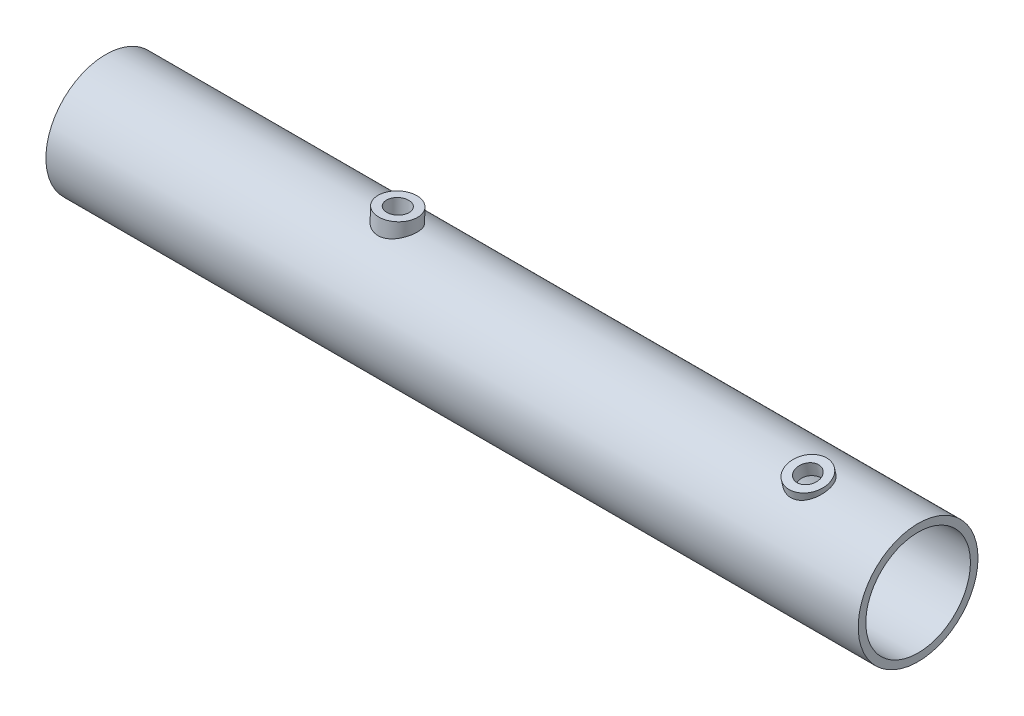
ISO-10303-21;
HEADER;
FILE_DESCRIPTION(('STEP AP214'),'2;1');
FILE_NAME('part.step','',(''),(''),'','','');
FILE_SCHEMA(('AUTOMOTIVE_DESIGN { 1 0 10303 214 1 1 1 1 }'));
ENDSEC;
DATA;
#1=APPLICATION_CONTEXT('core data for automotive mechanical design processes');
#2=APPLICATION_PROTOCOL_DEFINITION('international standard','automotive_design',2000,#1);
#3=PRODUCT_CONTEXT('',#1,'mechanical');
#4=PRODUCT('Part','Part','',(#3));
#5=PRODUCT_RELATED_PRODUCT_CATEGORY('part','',(#4));
#6=PRODUCT_DEFINITION_FORMATION('','',#4);
#7=PRODUCT_DEFINITION_CONTEXT('part definition',#1,'design');
#8=PRODUCT_DEFINITION('design','',#6,#7);
#9=PRODUCT_DEFINITION_SHAPE('','',#8);
#10=(LENGTH_UNIT() NAMED_UNIT(*) SI_UNIT(.MILLI.,.METRE.));
#11=(NAMED_UNIT(*) PLANE_ANGLE_UNIT() SI_UNIT($,.RADIAN.));
#12=(NAMED_UNIT(*) SI_UNIT($,.STERADIAN.) SOLID_ANGLE_UNIT());
#13=UNCERTAINTY_MEASURE_WITH_UNIT(LENGTH_MEASURE(1.E-05),#10,'distance_accuracy_value','');
#14=(GEOMETRIC_REPRESENTATION_CONTEXT(3) GLOBAL_UNCERTAINTY_ASSIGNED_CONTEXT((#13)) GLOBAL_UNIT_ASSIGNED_CONTEXT((#10,
#11,#12)) REPRESENTATION_CONTEXT('',''));
#15=CARTESIAN_POINT('',(0.,0.,0.));
#16=DIRECTION('',(0.,0.,1.));
#17=DIRECTION('',(1.,0.,0.));
#18=AXIS2_PLACEMENT_3D('',#15,#16,#17);
#19=CARTESIAN_POINT('',(295.,0.,0.));
#20=DIRECTION('',(-1.,0.,0.));
#21=DIRECTION('',(0.,0.,1.));
#22=AXIS2_PLACEMENT_3D('',#19,#20,#21);
#23=CYLINDRICAL_SURFACE('',#22,21.75);
#24=CARTESIAN_POINT('',(260.456376429784,18.3671321405636,11.6495045787826));
#25=CARTESIAN_POINT('',(260.646898102656,18.3671322417386,11.6495045007218));
#26=CARTESIAN_POINT('',(260.837421417738,18.3715626970911,11.6425279792126));
#27=CARTESIAN_POINT('',(261.217041275634,18.3891812990565,11.6146795241124));
#28=CARTESIAN_POINT('',(261.406137801234,18.4023695511696,11.5938074231295));
#29=CARTESIAN_POINT('',(261.781515058111,18.4372018067194,11.5383343317307));
#30=CARTESIAN_POINT('',(261.967795761762,18.458845893059,11.5037332067125));
#31=CARTESIAN_POINT('',(262.336289023577,18.5101185593613,11.4210496127633));
#32=CARTESIAN_POINT('',(262.518500030714,18.5397501290961,11.3729620955066));
#33=CARTESIAN_POINT('',(262.87711959476,18.6062822321463,11.263784134165));
#34=CARTESIAN_POINT('',(263.05354110399,18.6431650349375,11.2027253782472));
#35=CARTESIAN_POINT('',(263.399984059704,18.7235147451763,11.067910944351));
#36=CARTESIAN_POINT('',(263.570003093714,18.766984104073,10.994150537547));
#37=CARTESIAN_POINT('',(263.902523068557,18.8596627107682,10.8343961273323));
#38=CARTESIAN_POINT('',(264.065025642144,18.9088707037428,10.7484047974656));
#39=CARTESIAN_POINT('',(264.381639562437,19.0121510705117,10.5646453738589));
#40=CARTESIAN_POINT('',(264.53574763072,19.0662253232367,10.4668727262057));
#41=CARTESIAN_POINT('',(264.994705497099,19.2383436053802,10.1492809285233));
#42=CARTESIAN_POINT('',(265.284498725345,19.362951146295,9.91076902783006));
#43=CARTESIAN_POINT('',(265.817193347288,19.6207933919555,9.38994758260221));
#44=CARTESIAN_POINT('',(266.060086623045,19.7540295849195,9.1076304710237));
#45=CARTESIAN_POINT('',(266.387463593153,19.9559806708337,8.65160171178329));
#46=CARTESIAN_POINT('',(266.491618367903,20.0246286385753,8.49167365879143));
#47=CARTESIAN_POINT('',(266.68504944257,20.1609618094932,8.16270475630642));
#48=CARTESIAN_POINT('',(266.774331641192,20.2286473845811,7.99366755502538));
#49=CARTESIAN_POINT('',(266.937299999104,20.3620592692421,7.64744920143066));
#50=CARTESIAN_POINT('',(267.010982580518,20.4277851263774,7.47026619213941));
#51=CARTESIAN_POINT('',(267.14203678087,20.5562891341866,7.10902244017815));
#52=CARTESIAN_POINT('',(267.199415680647,20.6190685901636,6.92496480923295));
#53=CARTESIAN_POINT('',(267.295788115333,20.7389187532056,6.55713152126768));
#54=CARTESIAN_POINT('',(267.335306601108,20.7961073170407,6.37353172454558));
#55=CARTESIAN_POINT('',(267.398161180051,20.9062431420861,6.00241131812211));
#56=CARTESIAN_POINT('',(267.421503908972,20.9591921345945,5.81489234873673));
#57=CARTESIAN_POINT('',(267.451786011437,21.0603146866953,5.43726506663005));
#58=CARTESIAN_POINT('',(267.458725878233,21.1084883898441,5.24715683194374));
#59=CARTESIAN_POINT('',(267.456116137022,21.1996411705263,4.86581370608762));
#60=CARTESIAN_POINT('',(267.446566940301,21.2426203775968,4.67457884313778));
#61=CARTESIAN_POINT('',(267.411769610396,21.3215033189752,4.30013196804825));
#62=CARTESIAN_POINT('',(267.387164463296,21.3576212501996,4.11690490717022));
#63=CARTESIAN_POINT('',(267.323028891725,21.4247267490357,3.75206578003611));
#64=CARTESIAN_POINT('',(267.283493412799,21.4557125741284,3.5704542820415));
#65=CARTESIAN_POINT('',(267.189847446232,21.5125502700499,3.21028226877589));
#66=CARTESIAN_POINT('',(267.135741910704,21.5384038800534,3.03172073876127));
#67=CARTESIAN_POINT('',(267.013368442857,21.5851417264709,2.67877961845415));
#68=CARTESIAN_POINT('',(266.945095179497,21.6060240859303,2.50440162998132));
#69=CARTESIAN_POINT('',(266.794284097981,21.6432170238968,2.15962513541687));
#70=CARTESIAN_POINT('',(266.711628980722,21.6594868636175,1.98927357589332));
#71=CARTESIAN_POINT('',(266.533048124578,21.6875735747036,1.65522246113258));
#72=CARTESIAN_POINT('',(266.437117848047,21.6993889182906,1.49152520529413));
#73=CARTESIAN_POINT('',(266.232672789605,21.7189942911377,1.17193110052309));
#74=CARTESIAN_POINT('',(266.124157613075,21.7267841941323,1.01603449641129));
#75=CARTESIAN_POINT('',(265.895252211212,21.7388366271445,0.713071232884585));
#76=CARTESIAN_POINT('',(265.774861579487,21.7430990363998,0.566004875929366));
#77=CARTESIAN_POINT('',(265.517550594194,21.7487595813445,0.275583625796235));
#78=CARTESIAN_POINT('',(265.38014314423,21.7500272346696,0.132657406400566));
#79=CARTESIAN_POINT('',(265.094152514793,21.7499718786044,-0.141440651379987));
#80=CARTESIAN_POINT('',(264.945572863981,21.7486496839217,-0.272616172694221));
#81=CARTESIAN_POINT('',(264.63804922655,21.7440859989185,-0.522332149482237));
#82=CARTESIAN_POINT('',(264.479100038002,21.7408435385961,-0.640866183505778));
#83=CARTESIAN_POINT('',(264.151960690521,21.7331107033341,-0.86422602997955));
#84=CARTESIAN_POINT('',(263.983774114504,21.7286208095335,-0.969057104825561));
#85=CARTESIAN_POINT('',(263.636559678825,21.7189690382993,-1.16564165015239));
#86=CARTESIAN_POINT('',(263.457406259212,21.7137980185756,-1.25717316823259));
#87=CARTESIAN_POINT('',(263.091902280473,21.7034743779061,-1.42432970358908));
#88=CARTESIAN_POINT('',(262.905554493169,21.6983217506936,-1.49996077595809));
#89=CARTESIAN_POINT('',(262.526936811136,21.6885964805492,-1.63457689243846));
#90=CARTESIAN_POINT('',(262.33466741732,21.6840237887267,-1.69356334026665));
#91=CARTESIAN_POINT('',(261.945632380696,21.6759253047353,-1.79424608899837));
#92=CARTESIAN_POINT('',(261.748866931621,21.672399467549,-1.83594313342366));
#93=CARTESIAN_POINT('',(261.359916055582,21.6668479495967,-1.90031635775887));
#94=CARTESIAN_POINT('',(261.167840904155,21.6647703319852,-1.92365540572365));
#95=CARTESIAN_POINT('',(260.782382824914,21.6620884268045,-1.95362587281871));
#96=CARTESIAN_POINT('',(260.588999936067,21.6614840955276,-1.96025778759665));
#97=CARTESIAN_POINT('',(260.202416564243,21.661802278276,-1.95673822639168));
#98=CARTESIAN_POINT('',(260.009216059463,21.6627245778844,-1.94658910732283));
#99=CARTESIAN_POINT('',(259.624430933613,21.6660142259454,-1.90962583390135));
#100=CARTESIAN_POINT('',(259.432846295204,21.6683815588713,-1.88281185861212));
#101=CARTESIAN_POINT('',(259.058366599581,21.6742606601696,-1.81385784924365));
#102=CARTESIAN_POINT('',(258.875382478462,21.6777363402197,-1.77219678822769));
#103=CARTESIAN_POINT('',(258.513448113292,21.6855503902809,-1.67386820421271));
#104=CARTESIAN_POINT('',(258.334499235252,21.6898890476872,-1.61719567988977));
#105=CARTESIAN_POINT('',(257.981901391771,21.6990384528948,-1.48940541318085));
#106=CARTESIAN_POINT('',(257.808251195607,21.7038490899584,-1.41829105502331));
#107=CARTESIAN_POINT('',(257.467216553194,21.7134848220033,-1.26221560946074));
#108=CARTESIAN_POINT('',(257.299834509451,21.718309921778,-1.17724927822896));
#109=CARTESIAN_POINT('',(256.967952963388,21.7275829672978,-0.991712928215651));
#110=CARTESIAN_POINT('',(256.803654664059,21.7320171400696,-0.890782303319407));
#111=CARTESIAN_POINT('',(256.483723014876,21.7397621932911,-0.675870687250705));
#112=CARTESIAN_POINT('',(256.328092685981,21.7430726841378,-0.561885187976744));
#113=CARTESIAN_POINT('',(256.02646817283,21.7479513714782,-0.321758746412558));
#114=CARTESIAN_POINT('',(255.880474549265,21.749519466678,-0.195617097890059));
#115=CARTESIAN_POINT('',(255.598996651283,21.7502930429308,0.0679001002227277));
#116=CARTESIAN_POINT('',(255.463512561331,21.7494984825238,0.205275846909043));
#117=CARTESIAN_POINT('',(255.198626761549,21.7448477613791,0.496063898453863));
#118=CARTESIAN_POINT('',(255.069691676239,21.7408692502668,0.649899792805963));
#119=CARTESIAN_POINT('',(254.825008735324,21.7290514936775,0.967502606920927));
#120=CARTESIAN_POINT('',(254.709256399508,21.7212135646891,1.13126612357422));
#121=CARTESIAN_POINT('',(254.491684043367,21.7010818941056,1.46762923940858));
#122=CARTESIAN_POINT('',(254.389868952296,21.6887865816263,1.64023193528069));
#123=CARTESIAN_POINT('',(254.201046239746,21.6592310334569,1.99286162996713));
#124=CARTESIAN_POINT('',(254.114032434179,21.6419728794282,2.17288548891338));
#125=CARTESIAN_POINT('',(253.956179995472,21.6022505309158,2.53743767877672));
#126=CARTESIAN_POINT('',(253.885205453408,21.5798336011232,2.72191226898782));
#127=CARTESIAN_POINT('',(253.759099234069,21.5294355878397,3.09538177586982));
#128=CARTESIAN_POINT('',(253.703961194915,21.5014567463579,3.28437484422227));
#129=CARTESIAN_POINT('',(253.609995179789,21.4397817441468,3.66544795491474));
#130=CARTESIAN_POINT('',(253.571166130149,21.4060859599852,3.85752779317921));
#131=CARTESIAN_POINT('',(253.510178665868,21.3329779941875,4.24323836328338));
#132=CARTESIAN_POINT('',(253.488019639087,21.2935660225189,4.43686903791088));
#133=CARTESIAN_POINT('',(253.461158887721,21.210983093471,4.81588053796673));
#134=CARTESIAN_POINT('',(253.455755371941,21.1680430263552,5.00126229950579));
#135=CARTESIAN_POINT('',(253.460452128356,21.0773370970595,5.37071235486291));
#136=CARTESIAN_POINT('',(253.470557689396,21.0295695938361,5.55478017909983));
#137=CARTESIAN_POINT('',(253.506165115584,20.9296539671317,5.92012976261077));
#138=CARTESIAN_POINT('',(253.531660385611,20.8775077283544,6.10141268122528));
#139=CARTESIAN_POINT('',(253.597804173579,20.7693274223144,6.46008093792177));
#140=CARTESIAN_POINT('',(253.638458367481,20.7132919051919,6.63746478969666));
#141=CARTESIAN_POINT('',(253.734039290517,20.5985974050972,6.98522972404015));
#142=CARTESIAN_POINT('',(253.788808405395,20.5399729702303,7.15566547910765));
#143=CARTESIAN_POINT('',(253.91235670334,20.4202461910246,7.49050966368584));
#144=CARTESIAN_POINT('',(253.98114098628,20.3591429511929,7.65491587338092));
#145=CARTESIAN_POINT('',(254.207707505405,20.1732813115385,8.13754642833287));
#146=CARTESIAN_POINT('',(254.385784312584,20.0458734058893,8.44547440777313));
#147=CARTESIAN_POINT('',(254.798741192857,19.7859987242758,9.03800706064655));
#148=CARTESIAN_POINT('',(255.035519017485,19.6535233013893,9.32128471653404));
#149=CARTESIAN_POINT('',(255.425474688215,19.4607108342185,9.71414740362359));
#150=CARTESIAN_POINT('',(255.561359474926,19.3973835289661,9.83983183116818));
#151=CARTESIAN_POINT('',(255.843958969838,19.2736966802644,10.0799461665451));
#152=CARTESIAN_POINT('',(255.990669815965,19.2133360911528,10.1943800542272));
#153=CARTESIAN_POINT('',(256.299516921875,19.0944971458704,10.4153247817997));
#154=CARTESIAN_POINT('',(256.462017809931,19.0361640768606,10.5214039041228));
#155=CARTESIAN_POINT('',(256.796645788223,18.9248963196898,10.7202507765377));
#156=CARTESIAN_POINT('',(256.96876941245,18.8719597069329,10.8130232771507));
#157=CARTESIAN_POINT('',(257.32155669818,18.7725399026555,10.9847208525162));
#158=CARTESIAN_POINT('',(257.502219461569,18.7260560344746,11.0636473794417));
#159=CARTESIAN_POINT('',(257.870859530844,18.6405407379539,11.2071282165658));
#160=CARTESIAN_POINT('',(258.058836102085,18.6015085634325,11.2716839659019));
#161=CARTESIAN_POINT('',(258.426716390816,18.5343466240096,11.3817547083484));
#162=CARTESIAN_POINT('',(258.606198790358,18.5056266112277,11.4283200482353));
#163=CARTESIAN_POINT('',(258.969100414851,18.4559386328033,11.5083905860708));
#164=CARTESIAN_POINT('',(259.152519324634,18.434970048991,11.5418968254829));
#165=CARTESIAN_POINT('',(259.522029998594,18.4012348994778,11.5956053083698));
#166=CARTESIAN_POINT('',(259.708121579366,18.3884677736935,11.6158084603244));
#167=CARTESIAN_POINT('',(260.081600694967,18.3714177848928,11.6427558489349));
#168=CARTESIAN_POINT('',(260.268987768054,18.3671320410523,11.6495046555597));
#169=CARTESIAN_POINT('',(260.456376429784,18.3671321405636,11.6495045787826));
#170=B_SPLINE_CURVE_WITH_KNOTS('',3,(#24,#25,#26,#27,#28,#29,#30,#31,#32,#33,#34,#35,#36,#37,
#38,#39,#40,#41,#42,#43,#44,#45,#46,#47,#48,#49,#50,#51,#52,#53,#54,#55,#56,#57,#58,#59,#60,#61,
#62,#63,#64,#65,#66,#67,#68,#69,#70,#71,#72,#73,#74,#75,#76,#77,#78,#79,#80,#81,#82,#83,#84,#85,
#86,#87,#88,#89,#90,#91,#92,#93,#94,#95,#96,#97,#98,#99,#100,#101,#102,#103,#104,#105,#106,#107,
#108,#109,#110,#111,#112,#113,#114,#115,#116,#117,#118,#119,#120,#121,#122,#123,#124,#125,#126,
#127,#128,#129,#130,#131,#132,#133,#134,#135,#136,#137,#138,#139,#140,#141,#142,#143,#144,#145,
#146,#147,#148,#149,#150,#151,#152,#153,#154,#155,#156,#157,#158,#159,#160,#161,#162,#163,#164,
#165,#166,#167,#168,#169),.UNSPECIFIED.,.T.,.F.,(4,2,2,2,2,2,2,2,2,2,2,2,2,2,2,2,2,2,2,2,2,2,2,
2,2,2,2,2,2,2,2,2,2,2,2,2,2,2,2,2,2,2,2,2,2,2,2,2,2,2,2,2,2,2,2,2,2,2,2,2,2,2,2,2,2,2,2,2,2,2,2,
2,4),(0.,0.571389678197333,1.1427862397185,1.71418840347069,2.28580474483246,2.85604038907651,
3.42648879290671,3.99681269413055,4.56735775800894,5.74810516762801,6.92905677064886,
7.53689538761278,8.14449234886982,8.75222851591014,9.35969285427679,9.94790904642436,
10.535883792609,11.1238408575162,11.7117832572702,12.2762168926292,12.840841780654,
13.4052750040702,13.9699209991468,14.5394088647516,15.1090918728322,15.6787927490201,
16.2485131278747,16.8426322534677,17.4365645126335,18.0307970466621,18.6248007007869,
19.2277949434523,19.8305591406023,20.4332724887052,21.0359599147464,21.6157343544472,
22.1954915938768,22.7751674127015,23.3548370030337,23.9172857203349,24.4799220631915,
25.0424267124329,25.6051448009862,26.18312003595,26.7612954621922,27.3395044987976,
27.9177236819375,28.519294928171,29.1206611140338,29.722239441505,30.3235658043978,
30.9195879383065,31.5153703008351,32.1111134351518,32.706834692109,33.2772423630863,
33.8478445954706,34.4182024748613,34.9887741283678,35.5532314856047,36.1178946069373,
37.2462781005066,38.4174455448929,39.003805403815,39.5899570874067,40.197144229145,
40.8041140600217,41.4110201934745,42.01786552196,42.5801332857373,43.1423561994731,
43.7045407145157,44.2665342426498),.UNSPECIFIED.);
#171=CARTESIAN_POINT('',(260.456376429784,18.3671321405636,11.6495045787826));
#172=VERTEX_POINT('',#171);
#173=EDGE_CURVE('E42',#172,#172,#170,.T.);
#174=ORIENTED_EDGE('',*,*,#173,.F.);
#175=EDGE_LOOP('',(#174));
#176=FACE_BOUND('',#175,.T.);
#177=CARTESIAN_POINT('',(295.,0.,0.));
#178=DIRECTION('',(1.,0.,0.));
#179=DIRECTION('',(0.,0.,-1.));
#180=AXIS2_PLACEMENT_3D('',#177,#178,#179);
#181=CIRCLE('',#180,21.75);
#182=CARTESIAN_POINT('',(295.,0.,-21.75));
#183=VERTEX_POINT('',#182);
#184=EDGE_CURVE('E46',#183,#183,#181,.T.);
#185=ORIENTED_EDGE('',*,*,#184,.F.);
#186=EDGE_LOOP('',(#185));
#187=FACE_BOUND('',#186,.T.);
#188=CARTESIAN_POINT('',(0.,0.,0.));
#189=DIRECTION('',(1.,0.,0.));
#190=DIRECTION('',(0.,0.,-1.));
#191=AXIS2_PLACEMENT_3D('',#188,#189,#190);
#192=CIRCLE('',#191,21.75);
#193=CARTESIAN_POINT('',(0.,0.,-21.75));
#194=VERTEX_POINT('',#193);
#195=EDGE_CURVE('E50',#194,#194,#192,.T.);
#196=ORIENTED_EDGE('',*,*,#195,.T.);
#197=EDGE_LOOP('',(#196));
#198=FACE_BOUND('',#197,.T.);
#199=CARTESIAN_POINT('',(105.42644355876,20.7342913544785,6.56899246670265));
#200=CARTESIAN_POINT('',(105.61761622317,20.7342914649437,6.56899231964091));
#201=CARTESIAN_POINT('',(105.808791134861,20.7368002374002,6.5610892040586));
#202=CARTESIAN_POINT('',(106.189710828106,20.7467478425617,6.52956542817701));
#203=CARTESIAN_POINT('',(106.379455584877,20.7541867605066,6.50594449612399));
#204=CARTESIAN_POINT('',(106.756125793255,20.7737436123354,6.44322532082809));
#205=CARTESIAN_POINT('',(106.943051183493,20.7858616479181,6.40412674118373));
#206=CARTESIAN_POINT('',(107.312822300558,20.8143823689515,6.31081320129046));
#207=CARTESIAN_POINT('',(107.495666471318,20.8307866593475,6.25659257822988));
#208=CARTESIAN_POINT('',(107.855551616769,20.8673123397854,6.13366730177155));
#209=CARTESIAN_POINT('',(108.032605355263,20.8874247995185,6.06499739133372));
#210=CARTESIAN_POINT('',(108.38026160528,20.9307725160008,5.91366585936169));
#211=CARTESIAN_POINT('',(108.55086165464,20.9540089494915,5.83099896237015));
#212=CARTESIAN_POINT('',(109.051280539083,21.0273704998056,5.56296613661674));
#213=CARTESIAN_POINT('',(109.370023813059,21.0811807512872,5.35746292344752));
#214=CARTESIAN_POINT('',(109.980467860493,21.1944809222411,4.89038937479742));
#215=CARTESIAN_POINT('',(110.270842971192,21.2541032716554,4.62711798723189));
#216=CARTESIAN_POINT('',(110.670854487131,21.3413342741562,4.19896183071144));
#217=CARTESIAN_POINT('',(110.798332075107,21.3700607142372,4.05060286810402));
#218=CARTESIAN_POINT('',(111.040652577443,21.4259609794756,3.74365958716139));
#219=CARTESIAN_POINT('',(111.155500230249,21.453135385067,3.5850791393415));
#220=CARTESIAN_POINT('',(111.374472347296,21.5057862315671,3.25458976198307));
#221=CARTESIAN_POINT('',(111.478258241249,21.5312034786493,3.08244715714844));
#222=CARTESIAN_POINT('',(111.670893931814,21.5787676958475,2.72964242799672));
#223=CARTESIAN_POINT('',(111.759749276262,21.6009158802954,2.54898350023683));
#224=CARTESIAN_POINT('',(111.921813560263,21.6412329261512,2.18034696452618));
#225=CARTESIAN_POINT('',(111.995022621971,21.6594018186264,1.99236941372741));
#226=CARTESIAN_POINT('',(112.125122170156,21.6911406541621,1.61047214758083));
#227=CARTESIAN_POINT('',(112.182013342325,21.7047107904705,1.41655268229644));
#228=CARTESIAN_POINT('',(112.277249342859,21.7263771701451,1.03102658883643));
#229=CARTESIAN_POINT('',(112.316166172426,21.7346460697053,0.839570879810655));
#230=CARTESIAN_POINT('',(112.377893408564,21.7461180558689,0.453932524506414));
#231=CARTESIAN_POINT('',(112.400704452038,21.7493213427983,0.259749986370263));
#232=CARTESIAN_POINT('',(112.429987419854,21.7504846090225,-0.12981862036816));
#233=CARTESIAN_POINT('',(112.436462774807,21.7484456894003,-0.325204427633797));
#234=CARTESIAN_POINT('',(112.433013264391,21.7390986424883,-0.715702860345628));
#235=CARTESIAN_POINT('',(112.423088775319,21.7317906361009,-0.91081549195708));
#236=CARTESIAN_POINT('',(112.387641006381,21.7124154554608,-1.29168620927507));
#237=CARTESIAN_POINT('',(112.362740370034,21.7005447423969,-1.47751264363137));
#238=CARTESIAN_POINT('',(112.298093687158,21.6722855485276,-1.84627925093861));
#239=CARTESIAN_POINT('',(112.258342707113,21.6558955668253,-2.02921844362899));
#240=CARTESIAN_POINT('',(112.164357743637,21.6189595563349,-2.39083971057021));
#241=CARTESIAN_POINT('',(112.110128479066,21.5984148822003,-2.56952315125356));
#242=CARTESIAN_POINT('',(111.987609389843,21.5536143256011,-2.92159470004741));
#243=CARTESIAN_POINT('',(111.919314264004,21.5293570448051,-3.09498078329797));
#244=CARTESIAN_POINT('',(111.768331561509,21.4773781157194,-3.43730327074111));
#245=CARTESIAN_POINT('',(111.685484722792,21.4496192052589,-3.60616373298758));
#246=CARTESIAN_POINT('',(111.506552166455,21.3914936908516,-3.93631900349587));
#247=CARTESIAN_POINT('',(111.410461917622,21.361126195727,-4.09761119685805));
#248=CARTESIAN_POINT('',(111.20573146209,21.2984875484485,-4.41163995761499));
#249=CARTESIAN_POINT('',(111.09709069557,21.266216311409,-4.56437614291383));
#250=CARTESIAN_POINT('',(110.86797011288,21.2005120974818,-4.86043039343062));
#251=CARTESIAN_POINT('',(110.747489875026,21.1670790792428,-5.0037481228904));
#252=CARTESIAN_POINT('',(110.489687464432,21.0982910648142,-5.28646706846969));
#253=CARTESIAN_POINT('',(110.351848182984,21.0629178762801,-5.4253927302117));
#254=CARTESIAN_POINT('',(110.064967123188,20.9926606492623,-5.69118564994214));
#255=CARTESIAN_POINT('',(109.915928866655,20.9577764610602,-5.81805667064707));
#256=CARTESIAN_POINT('',(109.607457193639,20.8893762413824,-6.05905622384778));
#257=CARTESIAN_POINT('',(109.448018444608,20.8558609263053,-6.17317813697307));
#258=CARTESIAN_POINT('',(109.119868680845,20.7911292261005,-6.38780157186658));
#259=CARTESIAN_POINT('',(108.951161283128,20.7599119551523,-6.48830835450457));
#260=CARTESIAN_POINT('',(108.602836842412,20.7001746271314,-6.67646369097894));
#261=CARTESIAN_POINT('',(108.423092446402,20.6717030994427,-6.76389218538646));
#262=CARTESIAN_POINT('',(108.056370822652,20.6188655850897,-6.92328932541984));
#263=CARTESIAN_POINT('',(107.869396407719,20.5944980211677,-6.9952639133115));
#264=CARTESIAN_POINT('',(107.489498198454,20.5506121270152,-7.12316060547992));
#265=CARTESIAN_POINT('',(107.296575028947,20.5310932894377,-7.1790843893296));
#266=CARTESIAN_POINT('',(106.906212801523,20.4975312417467,-7.27435703760065));
#267=CARTESIAN_POINT('',(106.708773955138,20.4834877756987,-7.31370667675197));
#268=CARTESIAN_POINT('',(106.319096906722,20.4617970958955,-7.37416753054218));
#269=CARTESIAN_POINT('',(106.126977600706,20.4539111342226,-7.39596068480141));
#270=CARTESIAN_POINT('',(105.741452148633,20.4438510847573,-7.42372370783662));
#271=CARTESIAN_POINT('',(105.548046045382,20.4416768079023,-7.42969410036197));
#272=CARTESIAN_POINT('',(105.161448553451,20.4431116069971,-7.42574518190556));
#273=CARTESIAN_POINT('',(104.968257136233,20.4467197901995,-7.41582832373815));
#274=CARTESIAN_POINT('',(104.583530174342,20.4596078878987,-7.38019667947714));
#275=CARTESIAN_POINT('',(104.391994609024,20.4688877315786,-7.35448209063526));
#276=CARTESIAN_POINT('',(104.018234863805,20.4924409703972,-7.28858974401313));
#277=CARTESIAN_POINT('',(103.835911097352,20.5065409993146,-7.24891287286247));
#278=CARTESIAN_POINT('',(103.475322039694,20.5393864141895,-7.15531715755702));
#279=CARTESIAN_POINT('',(103.297058118775,20.5581333439308,-7.10139357999758));
#280=CARTESIAN_POINT('',(102.94584878327,20.5997491252352,-6.97975376873141));
#281=CARTESIAN_POINT('',(102.772902118335,20.6226169989473,-6.91204080658731));
#282=CARTESIAN_POINT('',(102.433284367832,20.6718776992514,-6.76329127792212));
#283=CARTESIAN_POINT('',(102.266615690223,20.698271861073,-6.68224966180502));
#284=CARTESIAN_POINT('',(101.936170598964,20.7546563060406,-6.50504545079798));
#285=CARTESIAN_POINT('',(101.772595728979,20.784724797745,-6.40853191223721));
#286=CARTESIAN_POINT('',(101.454096050278,20.8470820437405,-6.20267973115886));
#287=CARTESIAN_POINT('',(101.299174253839,20.8793715625864,-6.09333666303713));
#288=CARTESIAN_POINT('',(100.998934067094,20.9453464417816,-5.86253904155953));
#289=CARTESIAN_POINT('',(100.853616282319,20.9790318899265,-5.74108372573761));
#290=CARTESIAN_POINT('',(100.573439200551,21.0469677804168,-5.48679905378874));
#291=CARTESIAN_POINT('',(100.438580118835,21.0812182343744,-5.35396946365689));
#292=CARTESIAN_POINT('',(100.174550785555,21.1509296486664,-5.07175459709356));
#293=CARTESIAN_POINT('',(100.045875751006,21.1863792068337,-4.92190265995209));
#294=CARTESIAN_POINT('',(99.8016838937065,21.2560671744943,-4.61165623351523));
#295=CARTESIAN_POINT('',(99.6861626607064,21.2903059872601,-4.45126530638162));
#296=CARTESIAN_POINT('',(99.4690073021004,21.3567209908802,-4.12084586539018));
#297=CARTESIAN_POINT('',(99.3673783251355,21.3888964146846,-3.95081381126397));
#298=CARTESIAN_POINT('',(99.1788713398998,21.4503353822881,-3.6023457300248));
#299=CARTESIAN_POINT('',(99.0919872255905,21.4796001293477,-3.42391322094522));
#300=CARTESIAN_POINT('',(98.9340991004518,21.5343225574666,-3.06087330904641));
#301=CARTESIAN_POINT('',(98.8630038187707,21.559801821941,-2.8763088856536));
#302=CARTESIAN_POINT('',(98.7366792300995,21.6065094875409,-2.50138280720846));
#303=CARTESIAN_POINT('',(98.681443586356,21.6277395854003,-2.31102350123292));
#304=CARTESIAN_POINT('',(98.5873087387711,21.6654338588504,-1.9258542597688));
#305=CARTESIAN_POINT('',(98.5484085256023,21.6818983288783,-1.73104460004143));
#306=CARTESIAN_POINT('',(98.4873125639382,21.7096691499526,-1.33846215685381));
#307=CARTESIAN_POINT('',(98.4651161934391,21.7209756930596,-1.14068948400752));
#308=CARTESIAN_POINT('',(98.4382183927656,21.7378266158282,-0.752078543455645));
#309=CARTESIAN_POINT('',(98.4328216711763,21.7435929564113,-0.561297690258433));
#310=CARTESIAN_POINT('',(98.4375999987409,21.7500940169573,-0.179778193360682));
#311=CARTESIAN_POINT('',(98.4477803690577,21.7508270170525,0.0109604136452912));
#312=CARTESIAN_POINT('',(98.4836165209002,21.7473172172215,0.390845739138539));
#313=CARTESIAN_POINT('',(98.5092655362014,21.7430765920699,0.579993116996348));
#314=CARTESIAN_POINT('',(98.5758063475601,21.7298150424645,0.955484965826434));
#315=CARTESIAN_POINT('',(98.6167038421637,21.7207923303532,1.14182836179638));
#316=CARTESIAN_POINT('',(98.7127654620478,21.6984259100945,1.50798169630958));
#317=CARTESIAN_POINT('',(98.7677402217285,21.6851390044587,1.68784473859988));
#318=CARTESIAN_POINT('',(98.8917427198156,21.6546314083193,2.04234300729451));
#319=CARTESIAN_POINT('',(98.9607755726684,21.6374092858735,2.21697630447769));
#320=CARTESIAN_POINT('',(99.1881611359994,21.5805802945052,2.73122282440074));
#321=CARTESIAN_POINT('',(99.3668835793201,21.5357903354245,3.06149568396676));
#322=CARTESIAN_POINT('',(99.7807696430164,21.4355696440862,3.69959599747352));
#323=CARTESIAN_POINT('',(100.017688666384,21.3798215409583,4.00623442188274));
#324=CARTESIAN_POINT('',(100.407795768882,21.2938186369588,4.43362718657612));
#325=CARTESIAN_POINT('',(100.543719910153,21.2647343961821,4.5707430114169));
#326=CARTESIAN_POINT('',(100.826372903824,21.2065933228847,4.83331578286636));
#327=CARTESIAN_POINT('',(100.973097896373,21.177536484295,4.95877685857135));
#328=CARTESIAN_POINT('',(101.28167253397,21.1193031513153,5.20131051668615));
#329=CARTESIAN_POINT('',(101.443867420581,21.0901564021895,5.31795081883164));
#330=CARTESIAN_POINT('',(101.777808252155,21.0337021672598,5.53702680546858));
#331=CARTESIAN_POINT('',(101.949550766289,21.0063940284727,5.63946754677071));
#332=CARTESIAN_POINT('',(102.30149712122,20.954488320306,5.8293751372452));
#333=CARTESIAN_POINT('',(102.481700080953,20.9298904695678,5.91684354123797));
#334=CARTESIAN_POINT('',(102.84934129993,20.884223144804,6.0760669747898));
#335=CARTESIAN_POINT('',(103.036778847188,20.8631533246547,6.14782354599932));
#336=CARTESIAN_POINT('',(103.403568105123,20.8266554992512,6.27030288371707));
#337=CARTESIAN_POINT('',(103.582504368926,20.8109270157266,6.32218246071974));
#338=CARTESIAN_POINT('',(103.944259143557,20.7835995491138,6.41144859475932));
#339=CARTESIAN_POINT('',(104.127077358188,20.7720002521569,6.44883625337846));
#340=CARTESIAN_POINT('',(104.495349549747,20.7532928726578,6.50878817774275));
#341=CARTESIAN_POINT('',(104.680803409023,20.7461845902813,6.53135310304901));
#342=CARTESIAN_POINT('',(105.052985612492,20.7366845589717,6.56145282821879));
#343=CARTESIAN_POINT('',(105.239713513603,20.7342912465805,6.56899261034686));
#344=CARTESIAN_POINT('',(105.42644355876,20.7342913544785,6.56899246670265));
#345=B_SPLINE_CURVE_WITH_KNOTS('',3,(#199,#200,#201,#202,#203,#204,#205,#206,#207,#208,#209,
#210,#211,#212,#213,#214,#215,#216,#217,#218,#219,#220,#221,#222,#223,#224,#225,#226,#227,#228,
#229,#230,#231,#232,#233,#234,#235,#236,#237,#238,#239,#240,#241,#242,#243,#244,#245,#246,#247,
#248,#249,#250,#251,#252,#253,#254,#255,#256,#257,#258,#259,#260,#261,#262,#263,#264,#265,#266,
#267,#268,#269,#270,#271,#272,#273,#274,#275,#276,#277,#278,#279,#280,#281,#282,#283,#284,#285,
#286,#287,#288,#289,#290,#291,#292,#293,#294,#295,#296,#297,#298,#299,#300,#301,#302,#303,#304,
#305,#306,#307,#308,#309,#310,#311,#312,#313,#314,#315,#316,#317,#318,#319,#320,#321,#322,#323,
#324,#325,#326,#327,#328,#329,#330,#331,#332,#333,#334,#335,#336,#337,#338,#339,#340,#341,#342,
#343,#344),.UNSPECIFIED.,.T.,.F.,(4,2,2,2,2,2,2,2,2,2,2,2,2,2,2,2,2,2,2,2,2,2,2,2,2,2,2,2,2,2,2,
2,2,2,2,2,2,2,2,2,2,2,2,2,2,2,2,2,2,2,2,2,2,2,2,2,2,2,2,2,2,2,2,2,2,2,2,2,2,2,2,2,4),(0.,
0.573343248068709,1.14669640923369,1.72006203272171,2.2936426556699,2.8658595636313,
3.43829262190539,4.58219561381935,5.76587326135187,6.35842153759872,6.95074674013156,
7.55783366995935,8.1646945195549,8.77155063105249,9.37838123820382,9.96428170686714,
10.5501590047768,11.1359132539621,11.7216540630915,12.2845797614207,12.8476926389703,
13.4106222065499,13.9737643223759,14.5435048545864,15.1134408088428,15.6834021951562,
16.2533838889921,16.8493215725768,17.44507262579,18.041131570903,18.6369595385831,
19.2418962282428,19.8465998921785,20.4512402562012,21.0558523542108,21.6356628313744,
22.2154541159866,22.795155895915,23.3748504377874,23.9355730032642,24.4964821011021,
25.057258276705,25.6182473953207,26.1944750457516,26.7709020561527,27.3473653755694,
27.923840557515,28.525145596338,29.126248430199,29.7275734396496,30.3286488217558,
30.9261534670788,31.5234190448289,32.12064771353,32.7178541420244,33.2899909550307,
33.8623232546516,34.434405388669,35.0067015315277,35.5716703373929,36.1368450517847,
37.2662329888077,38.4351211446499,39.0203316801368,39.6053340875412,40.2102969945398,
40.815043902882,41.4197279724029,42.0243526834996,42.5846254536448,43.1448556271098,
43.7050608705524,44.2650803217241),.UNSPECIFIED.);
#346=CARTESIAN_POINT('',(105.42644355876,20.7342913544785,6.56899246670265));
#347=VERTEX_POINT('',#346);
#348=EDGE_CURVE('E10',#347,#347,#345,.T.);
#349=ORIENTED_EDGE('',*,*,#348,.F.);
#350=EDGE_LOOP('',(#349));
#351=FACE_BOUND('',#350,.T.);
#352=ADVANCED_FACE('F32',(#176,#187,#198,#351),#23,.T.);
#353=CARTESIAN_POINT('',(295.,0.,0.));
#354=DIRECTION('',(1.,0.,0.));
#355=DIRECTION('',(0.,0.,-1.));
#356=AXIS2_PLACEMENT_3D('',#353,#354,#355);
#357=PLANE('',#356);
#358=ORIENTED_EDGE('',*,*,#184,.T.);
#359=EDGE_LOOP('',(#358));
#360=FACE_BOUND('',#359,.T.);
#361=CARTESIAN_POINT('',(295.,0.,0.));
#362=DIRECTION('',(1.,0.,0.));
#363=DIRECTION('',(0.,0.,-1.));
#364=AXIS2_PLACEMENT_3D('',#361,#362,#363);
#365=CIRCLE('',#364,19.);
#366=CARTESIAN_POINT('',(295.,0.,-19.));
#367=VERTEX_POINT('',#366);
#368=EDGE_CURVE('E118',#367,#367,#365,.T.);
#369=ORIENTED_EDGE('',*,*,#368,.F.);
#370=EDGE_LOOP('',(#369));
#371=FACE_BOUND('',#370,.T.);
#372=ADVANCED_FACE('F75',(#360,#371),#357,.T.);
#373=CARTESIAN_POINT('',(0.,0.,0.));
#374=DIRECTION('',(1.,0.,0.));
#375=DIRECTION('',(0.,0.,-1.));
#376=AXIS2_PLACEMENT_3D('',#373,#374,#375);
#377=PLANE('',#376);
#378=ORIENTED_EDGE('',*,*,#195,.F.);
#379=EDGE_LOOP('',(#378));
#380=FACE_BOUND('',#379,.T.);
#381=CARTESIAN_POINT('',(0.,0.,0.));
#382=DIRECTION('',(1.,0.,0.));
#383=DIRECTION('',(0.,0.,-1.));
#384=AXIS2_PLACEMENT_3D('',#381,#382,#383);
#385=CIRCLE('',#384,19.);
#386=CARTESIAN_POINT('',(0.,0.,-19.));
#387=VERTEX_POINT('',#386);
#388=EDGE_CURVE('E120',#387,#387,#385,.T.);
#389=ORIENTED_EDGE('',*,*,#388,.T.);
#390=EDGE_LOOP('',(#389));
#391=FACE_BOUND('',#390,.T.);
#392=ADVANCED_FACE('F73',(#380,#391),#377,.F.);
#393=CARTESIAN_POINT('',(295.,0.,0.));
#394=DIRECTION('',(-1.,0.,0.));
#395=DIRECTION('',(0.,0.,1.));
#396=AXIS2_PLACEMENT_3D('',#393,#394,#395);
#397=CYLINDRICAL_SURFACE('',#396,19.);
#398=CARTESIAN_POINT('',(105.41224964478,18.6518921163836,3.62034811569111));
#399=CARTESIAN_POINT('',(105.19060275322,18.6518963751163,3.62034017610146));
#400=CARTESIAN_POINT('',(104.968860254863,18.6555283946794,3.60176637563214));
#401=CARTESIAN_POINT('',(104.531666922402,18.6696128162529,3.52801857953967));
#402=CARTESIAN_POINT('',(104.316220870493,18.6800702684403,3.47281748266581));
#403=CARTESIAN_POINT('',(103.898007768727,18.7064769087578,3.32763031501209));
#404=CARTESIAN_POINT('',(103.695227830519,18.7224204033725,3.23768029547191));
#405=CARTESIAN_POINT('',(103.307580462627,18.7578435186748,3.02569070943351));
#406=CARTESIAN_POINT('',(103.122712467595,18.7773230277005,2.90365215618652));
#407=CARTESIAN_POINT('',(102.773225292337,18.8177575580084,2.6289709130444));
#408=CARTESIAN_POINT('',(102.608926821479,18.8387294547212,2.47592262471257));
#409=CARTESIAN_POINT('',(102.308015577708,18.8793254647274,2.14450301639505));
#410=CARTESIAN_POINT('',(102.171405032105,18.8989494695079,1.96612966113667));
#411=CARTESIAN_POINT('',(101.928272615483,18.9345946562956,1.58674833433694));
#412=CARTESIAN_POINT('',(101.822102579732,18.9505733048236,1.38551052152845));
#413=CARTESIAN_POINT('',(101.645080961913,18.9764940375609,0.967692153061702));
#414=CARTESIAN_POINT('',(101.574226112816,18.9864366801834,0.751113018756313));
#415=CARTESIAN_POINT('',(101.470759342726,18.9986957038117,0.311772965417624));
#416=CARTESIAN_POINT('',(101.43766088017,19.00110982078,0.0891294524836749));
#417=CARTESIAN_POINT('',(101.409143607661,18.9979354858819,-0.358491267647102));
#418=CARTESIAN_POINT('',(101.413720850594,18.9923478723713,-0.583468227912835));
#419=CARTESIAN_POINT('',(101.460045127636,18.9735672156234,-1.02566278904921));
#420=CARTESIAN_POINT('',(101.501211510728,18.9604941119131,-1.24294667933634));
#421=CARTESIAN_POINT('',(101.618643150194,18.9279008842028,-1.66729809149699));
#422=CARTESIAN_POINT('',(101.694909711365,18.9083805205428,-1.87436523326062));
#423=CARTESIAN_POINT('',(101.880813535661,18.864529045936,-2.27380359684213));
#424=CARTESIAN_POINT('',(101.99063672155,18.8401714038217,-2.46608527464107));
#425=CARTESIAN_POINT('',(102.240418420267,18.789014736933,-2.82960640901918));
#426=CARTESIAN_POINT('',(102.380380485822,18.7622154245532,-3.00084338113916));
#427=CARTESIAN_POINT('',(102.689433817399,18.7082879224676,-3.32065871686034));
#428=CARTESIAN_POINT('',(102.858998449636,18.6811623494705,-3.46878044049633));
#429=CARTESIAN_POINT('',(103.220905983455,18.6298454874521,-3.73460030897866));
#430=CARTESIAN_POINT('',(103.413249290139,18.6056542506313,-3.85229791263571));
#431=CARTESIAN_POINT('',(103.815902561491,18.5627255780309,-4.05412613239755));
#432=CARTESIAN_POINT('',(104.026249272739,18.5439996581594,-4.13818600706999));
#433=CARTESIAN_POINT('',(104.458574772979,18.5141393513787,-4.26980621847196));
#434=CARTESIAN_POINT('',(104.680551951128,18.5030039161484,-4.31737159556691));
#435=CARTESIAN_POINT('',(105.125599120009,18.4897015792281,-4.37398848606111));
#436=CARTESIAN_POINT('',(105.348579185832,18.4873784309109,-4.38371105498788));
#437=CARTESIAN_POINT('',(105.792991433085,18.4915187546157,-4.36621254139707));
#438=CARTESIAN_POINT('',(106.014423696238,18.4979817591613,-4.33899342440026));
#439=CARTESIAN_POINT('',(106.44737483084,18.5188736203668,-4.24892941298092));
#440=CARTESIAN_POINT('',(106.658966097536,18.5332287354072,-4.18641417179364));
#441=CARTESIAN_POINT('',(107.06863555229,18.56832457624,-4.02788688881009));
#442=CARTESIAN_POINT('',(107.266712466956,18.5890659027622,-3.9318716956715));
#443=CARTESIAN_POINT('',(107.646966149345,18.6351470752571,-3.70736711467625));
#444=CARTESIAN_POINT('',(107.828861796868,18.6605508769105,-3.57841486128976));
#445=CARTESIAN_POINT('',(108.168586929429,18.7131558278146,-3.29225083828048));
#446=CARTESIAN_POINT('',(108.326413735523,18.7403571766561,-3.13503592716521));
#447=CARTESIAN_POINT('',(108.616114245071,18.7942964834043,-2.79368909904208));
#448=CARTESIAN_POINT('',(108.747526366646,18.821019807707,-2.60916258164382));
#449=CARTESIAN_POINT('',(108.977337640722,18.8708610604919,-2.22013515595664));
#450=CARTESIAN_POINT('',(109.075738640171,18.8939791906435,-2.01563536598539));
#451=CARTESIAN_POINT('',(109.23587789252,18.934190781646,-1.59401280099099));
#452=CARTESIAN_POINT('',(109.29789509989,18.9513296626103,-1.37700046435765));
#453=CARTESIAN_POINT('',(109.384437394696,18.9782599475796,-0.935191573445594));
#454=CARTESIAN_POINT('',(109.408967729948,18.9880523799218,-0.710396113238931));
#455=CARTESIAN_POINT('',(109.4196326747,18.9994475026481,-0.264217826945471));
#456=CARTESIAN_POINT('',(109.406526806977,19.0012103669352,-0.0428568784966638));
#457=CARTESIAN_POINT('',(109.344000952196,18.9971617291123,0.394592648655496));
#458=CARTESIAN_POINT('',(109.294581402381,18.9913503182016,0.610681290808925));
#459=CARTESIAN_POINT('',(109.161146368319,18.9731669347097,1.03109511568932));
#460=CARTESIAN_POINT('',(109.077201551344,18.9608083482698,1.23544336091605));
#461=CARTESIAN_POINT('',(108.877217560853,18.9311986253177,1.6273887222162));
#462=CARTESIAN_POINT('',(108.761175268686,18.9139470133856,1.81498420821535));
#463=CARTESIAN_POINT('',(108.497675714429,18.8763186210617,2.17197411640066));
#464=CARTESIAN_POINT('',(108.34965488803,18.8558879071508,2.34094692714838));
#465=CARTESIAN_POINT('',(108.027569063448,18.8146707495119,2.65194907872739));
#466=CARTESIAN_POINT('',(107.853497625789,18.7938842189576,2.79397173798313));
#467=CARTESIAN_POINT('',(107.481476194414,18.7542430038804,3.04881409058851));
#468=CARTESIAN_POINT('',(107.283238719587,18.7354177786844,3.1612190830151));
#469=CARTESIAN_POINT('',(106.870353431052,18.7024405065716,3.35082874201826));
#470=CARTESIAN_POINT('',(106.655720156258,18.6882843772586,3.42806418149508));
#471=CARTESIAN_POINT('',(106.269342525269,18.6690993257901,3.53082362250742));
#472=CARTESIAN_POINT('',(106.099744524571,18.6626923239751,3.56432809825292));
#473=CARTESIAN_POINT('',(105.757533477614,18.6540871589782,3.60909291656044));
#474=CARTESIAN_POINT('',(105.584920572947,18.6518887986771,3.620354300918));
#475=CARTESIAN_POINT('',(105.41224964478,18.6518921163836,3.62034811569111));
#476=B_SPLINE_CURVE_WITH_KNOTS('',3,(#398,#399,#400,#401,#402,#403,#404,#405,#406,#407,#408,
#409,#410,#411,#412,#413,#414,#415,#416,#417,#418,#419,#420,#421,#422,#423,#424,#425,#426,#427,
#428,#429,#430,#431,#432,#433,#434,#435,#436,#437,#438,#439,#440,#441,#442,#443,#444,#445,#446,
#447,#448,#449,#450,#451,#452,#453,#454,#455,#456,#457,#458,#459,#460,#461,#462,#463,#464,#465,
#466,#467,#468,#469,#470,#471,#472,#473,#474,#475),.UNSPECIFIED.,.T.,.F.,(4,2,2,2,2,2,2,2,2,2,2,
2,2,2,2,2,2,2,2,2,2,2,2,2,2,2,2,2,2,2,2,2,2,2,2,2,2,2,4),(0.,0.664308799606257,1.32910968319093,
1.99322269485035,2.6573147385049,3.33072996963838,4.00419935108293,4.68516496369073,
5.36606756805946,6.03809303492639,6.71004809762499,7.37152627370024,8.0330290412693,
8.69826549269975,9.36358040416775,10.0407162139886,10.7178640679847,11.3964285986947,
12.0748993939269,12.7412827331102,13.4076306180656,14.067855623282,14.7281427526535,
15.3982752144895,16.068482209982,16.7495405514469,17.4305607818102,18.1062889871576,
18.7819225881321,19.4440178668307,20.1061051735458,20.7668439930889,21.4276470338423,
22.1012153494107,22.7749504408278,23.4576702918109,24.1397916185015,24.6573363902362,
25.174856921248),.UNSPECIFIED.);
#477=CARTESIAN_POINT('',(105.41224964478,18.6518921163836,3.62034811569111));
#478=VERTEX_POINT('',#477);
#479=EDGE_CURVE('E84',#478,#478,#476,.T.);
#480=ORIENTED_EDGE('',*,*,#479,.F.);
#481=EDGE_LOOP('',(#480));
#482=FACE_BOUND('',#481,.T.);
#483=CARTESIAN_POINT('',(260.4544882865,17.0986070346099,8.28478348998868));
#484=CARTESIAN_POINT('',(260.233012480773,17.0986132876334,8.28477676661041));
#485=CARTESIAN_POINT('',(260.01143999696,17.1068978960119,8.26773897101407));
#486=CARTESIAN_POINT('',(259.574595329833,17.1394502322255,8.20003682898792));
#487=CARTESIAN_POINT('',(259.359328051067,17.1637300743886,8.14934699525105));
#488=CARTESIAN_POINT('',(258.941490195025,17.226498178425,8.01580691094821));
#489=CARTESIAN_POINT('',(258.738905416295,17.2649702029953,7.93299340757667));
#490=CARTESIAN_POINT('',(258.351599632294,17.3535290087107,7.73734520836437));
#491=CARTESIAN_POINT('',(258.166878163944,17.4036154886549,7.62451129103992));
#492=CARTESIAN_POINT('',(257.817261912611,17.5131338629784,7.3695081119881));
#493=CARTESIAN_POINT('',(257.652729124555,17.5727017025268,7.22690089254067));
#494=CARTESIAN_POINT('',(257.351308793252,17.6970280795916,6.91686667855642));
#495=CARTESIAN_POINT('',(257.214423789698,17.7617870932007,6.74943740634107));
#496=CARTESIAN_POINT('',(256.970495121266,17.8937413670406,6.39146418442703));
#497=CARTESIAN_POINT('',(256.863855578379,17.9609571947016,6.20065195341358));
#498=CARTESIAN_POINT('',(256.685999650648,18.0934859145005,5.80256145412297));
#499=CARTESIAN_POINT('',(256.614779879255,18.1587989880017,5.59528476224065));
#500=CARTESIAN_POINT('',(256.510790949652,18.2835724356163,5.17288940627423));
#501=CARTESIAN_POINT('',(256.477505572525,18.3431010458779,4.95791812436198));
#502=CARTESIAN_POINT('',(256.448779934326,18.4549980969367,4.52363762784146));
#503=CARTESIAN_POINT('',(256.453335142275,18.5073673942169,4.30432893572568));
#504=CARTESIAN_POINT('',(256.499766248772,18.6026191522342,3.8717895360645));
#505=CARTESIAN_POINT('',(256.540973374222,18.6456545000846,3.65852026699266));
#506=CARTESIAN_POINT('',(256.658533900791,18.7228773476659,3.24023524043363));
#507=CARTESIAN_POINT('',(256.73488825025,18.7570646086195,3.03521970581038));
#508=CARTESIAN_POINT('',(256.920849698965,18.8169742405915,2.6385449651093));
#509=CARTESIAN_POINT('',(257.030587321932,18.8426625437835,2.44694188350087));
#510=CARTESIAN_POINT('',(257.280110024681,18.8863151065887,2.08342735996842));
#511=CARTESIAN_POINT('',(257.419898598306,18.90427846734,1.91151821130521));
#512=CARTESIAN_POINT('',(257.728544082499,18.934108527137,1.58940735305764));
#513=CARTESIAN_POINT('',(257.897881195023,18.9458590306364,1.43965470580119));
#514=CARTESIAN_POINT('',(258.259229529102,18.9644125214249,1.17019411715235));
#515=CARTESIAN_POINT('',(258.451241446096,18.9712153569226,1.05048709761558));
#516=CARTESIAN_POINT('',(258.853565386959,18.9815046273559,0.844518554718942));
#517=CARTESIAN_POINT('',(259.063950895956,18.9849770110278,0.758399638373994));
#518=CARTESIAN_POINT('',(259.496348126446,18.9898945694865,0.623312542529174));
#519=CARTESIAN_POINT('',(259.718358410859,18.9913399942394,0.574339782478117));
#520=CARTESIAN_POINT('',(260.163927212372,18.9930203310386,0.515784319999555));
#521=CARTESIAN_POINT('',(260.387405115444,18.9932741073206,0.505588264932054));
#522=CARTESIAN_POINT('',(260.832840225106,18.9927954986204,0.523253750589881));
#523=CARTESIAN_POINT('',(261.054797514059,18.9920631674818,0.551113213401426));
#524=CARTESIAN_POINT('',(261.488735056535,18.9891566357316,0.643434036250815));
#525=CARTESIAN_POINT('',(261.700789786011,18.9869961297882,0.707546928550194));
#526=CARTESIAN_POINT('',(262.111341803128,18.9802468337905,0.869938982314922));
#527=CARTESIAN_POINT('',(262.309837955545,18.9756578406858,0.968221000489614));
#528=CARTESIAN_POINT('',(262.690417104836,18.9625897172211,1.19727503705474));
#529=CARTESIAN_POINT('',(262.872259094984,18.9540618265852,1.32844458708969));
#530=CARTESIAN_POINT('',(263.211816957175,18.9314881362556,1.6186054671519));
#531=CARTESIAN_POINT('',(263.369530468909,18.9174417972126,1.7775995157831));
#532=CARTESIAN_POINT('',(263.658628546384,18.8820236021576,2.12117205693335));
#533=CARTESIAN_POINT('',(263.78960830618,18.8605507509505,2.30608119624194));
#534=CARTESIAN_POINT('',(264.018608544303,18.8090262815588,2.69421541636483));
#535=CARTESIAN_POINT('',(264.116630937652,18.778975162011,2.89743943210383));
#536=CARTESIAN_POINT('',(264.276119899545,18.7098490586913,3.31448956284462));
#537=CARTESIAN_POINT('',(264.337863184007,18.670845624088,3.52822158176147));
#538=CARTESIAN_POINT('',(264.424017415362,18.5837824423467,3.96128358525276));
#539=CARTESIAN_POINT('',(264.448433074506,18.5357238391966,4.18061285967319));
#540=CARTESIAN_POINT('',(264.459095254358,18.4324908754926,4.6143354953504));
#541=CARTESIAN_POINT('',(264.446020384545,18.3774600451879,4.82874668193531));
#542=CARTESIAN_POINT('',(264.383643186514,18.2614218092794,5.25055569750806));
#543=CARTESIAN_POINT('',(264.334340846535,18.2004144017355,5.45795352421925));
#544=CARTESIAN_POINT('',(264.201088798896,18.0749193008169,5.86018080860133));
#545=CARTESIAN_POINT('',(264.117135999705,18.0104312973482,6.0550091430225));
#546=CARTESIAN_POINT('',(263.917071119269,17.8809899424121,6.42721347206564));
#547=CARTESIAN_POINT('',(263.800955742167,17.8160365439182,6.6045876755518));
#548=CARTESIAN_POINT('',(263.537170617219,17.6877307424309,6.9409843836889));
#549=CARTESIAN_POINT('',(263.388924390394,17.6244350746463,7.09957659683057));
#550=CARTESIAN_POINT('',(263.066254781912,17.5044252908564,7.39052931895965));
#551=CARTESIAN_POINT('',(262.891825106155,17.4477127631658,7.52288350292496));
#552=CARTESIAN_POINT('',(262.519279813987,17.3437944248882,7.75949297742718));
#553=CARTESIAN_POINT('',(262.320914003374,17.296705922468,7.86340624221393));
#554=CARTESIAN_POINT('',(261.90771827893,17.2161315158001,8.03829340954082));
#555=CARTESIAN_POINT('',(261.69290342954,17.1826333381923,8.10929704091311));
#556=CARTESIAN_POINT('',(261.307171011009,17.1379071473073,8.20329765404812));
#557=CARTESIAN_POINT('',(261.138436984648,17.123229489543,8.23380371227857));
#558=CARTESIAN_POINT('',(260.797984024007,17.1035772420598,8.27454874925048));
#559=CARTESIAN_POINT('',(260.62626523397,17.098602184756,8.28478870465036));
#560=CARTESIAN_POINT('',(260.4544882865,17.0986070346099,8.28478348998868));
#561=B_SPLINE_CURVE_WITH_KNOTS('',3,(#483,#484,#485,#486,#487,#488,#489,#490,#491,#492,#493,
#494,#495,#496,#497,#498,#499,#500,#501,#502,#503,#504,#505,#506,#507,#508,#509,#510,#511,#512,
#513,#514,#515,#516,#517,#518,#519,#520,#521,#522,#523,#524,#525,#526,#527,#528,#529,#530,#531,
#532,#533,#534,#535,#536,#537,#538,#539,#540,#541,#542,#543,#544,#545,#546,#547,#548,#549,#550,
#551,#552,#553,#554,#555,#556,#557,#558,#559,#560),.UNSPECIFIED.,.T.,.F.,(4,2,2,2,2,2,2,2,2,2,2,
2,2,2,2,2,2,2,2,2,2,2,2,2,2,2,2,2,2,2,2,2,2,2,2,2,2,2,4),(0.,0.663796786633494,1.32809689264952,
1.99163931695884,2.65516453536744,3.32924112645665,4.00337960933041,4.68614151751021,
5.36883813305718,6.04212918609316,6.71533962136824,7.37651264320496,8.03770350580588,
8.70151349797147,9.36540070911731,10.0413004405006,10.7172209072082,11.3959807166182,
12.0746568134711,12.7425521579413,13.4104110353352,14.0719569934422,14.7335582733965,
15.4035786672202,16.073664562245,16.7532468288438,17.4327896007837,18.1070795746684,
18.7812844189479,19.4433630559628,20.1054419078973,20.7675798435803,21.4297856568836,
22.1050349879209,22.7804468992802,23.4636560710949,24.1462468589866,24.661113396366,
25.1759551208356),.UNSPECIFIED.);
#562=CARTESIAN_POINT('',(260.4544882865,17.0986070346099,8.28478348998868));
#563=VERTEX_POINT('',#562);
#564=EDGE_CURVE('E78',#563,#563,#561,.T.);
#565=ORIENTED_EDGE('',*,*,#564,.F.);
#566=EDGE_LOOP('',(#565));
#567=FACE_BOUND('',#566,.T.);
#568=ORIENTED_EDGE('',*,*,#368,.T.);
#569=EDGE_LOOP('',(#568));
#570=FACE_BOUND('',#569,.T.);
#571=ORIENTED_EDGE('',*,*,#388,.F.);
#572=EDGE_LOOP('',(#571));
#573=FACE_BOUND('',#572,.T.);
#574=ADVANCED_FACE('F62',(#482,#567,#570,#573),#397,.F.);
#575=CARTESIAN_POINT('',(260.411833749763,-25.6889985960384,-5.53978134808974));
#576=DIRECTION('',(0.000952380802917792,0.97514156207003,0.221580745766479));
#577=DIRECTION('',(0.,-0.22158084625665,0.975142004311263));
#578=AXIS2_PLACEMENT_3D('',#575,#576,#577);
#579=CYLINDRICAL_SURFACE('',#578,6.99999999999982);
#580=CARTESIAN_POINT('',(260.45924997502,22.8604175859145,5.49206906477546));
#581=DIRECTION('',(-0.000952380802917792,-0.97514156207003,-0.221580745766479));
#582=DIRECTION('',(0.,0.22158084625665,-0.975142004311263));
#583=AXIS2_PLACEMENT_3D('',#580,#581,#582);
#584=CIRCLE('',#583,6.99999999999982);
#585=CARTESIAN_POINT('',(260.45924997502,24.411483509711,-1.3339249654032));
#586=VERTEX_POINT('',#585);
#587=EDGE_CURVE('E130',#586,#586,#584,.T.);
#588=ORIENTED_EDGE('',*,*,#587,.T.);
#589=EDGE_LOOP('',(#588));
#590=FACE_BOUND('',#589,.T.);
#591=ORIENTED_EDGE('',*,*,#173,.T.);
#592=EDGE_LOOP('',(#591));
#593=FACE_BOUND('',#592,.T.);
#594=ADVANCED_FACE('F56',(#590,#593),#579,.T.);
#595=CARTESIAN_POINT('',(260.45924997502,22.8604175859145,5.49206906477546));
#596=DIRECTION('',(-0.000952380802917792,-0.97514156207003,-0.221580745766479));
#597=DIRECTION('',(0.,0.22158084625665,-0.975142004311263));
#598=AXIS2_PLACEMENT_3D('',#595,#596,#597);
#599=PLANE('',#598);
#600=ORIENTED_EDGE('',*,*,#587,.F.);
#601=EDGE_LOOP('',(#600));
#602=FACE_BOUND('',#601,.T.);
#603=CARTESIAN_POINT('',(260.45924997502,22.8604175859145,5.49206906477546));
#604=DIRECTION('',(-0.000952380802917792,-0.97514156207003,-0.221580745766479));
#605=DIRECTION('',(0.,0.22158084625665,-0.975142004311263));
#606=AXIS2_PLACEMENT_3D('',#603,#604,#605);
#607=CIRCLE('',#606,4.00000000000006);
#608=CARTESIAN_POINT('',(260.45924997502,23.7467409709411,1.59150104753035));
#609=VERTEX_POINT('',#608);
#610=EDGE_CURVE('E125',#609,#609,#607,.T.);
#611=ORIENTED_EDGE('',*,*,#610,.T.);
#612=EDGE_LOOP('',(#611));
#613=FACE_BOUND('',#612,.T.);
#614=ADVANCED_FACE('F61',(#602,#613),#599,.F.);
#615=CARTESIAN_POINT('',(260.411833749763,-25.6889985960384,-5.53978134808974));
#616=DIRECTION('',(0.000952380802917792,0.97514156207003,0.221580745766479));
#617=DIRECTION('',(0.,-0.22158084625665,0.975142004311263));
#618=AXIS2_PLACEMENT_3D('',#615,#616,#617);
#619=CYLINDRICAL_SURFACE('',#618,4.00000000000006);
#620=ORIENTED_EDGE('',*,*,#610,.F.);
#621=EDGE_LOOP('',(#620));
#622=FACE_BOUND('',#621,.T.);
#623=ORIENTED_EDGE('',*,*,#564,.T.);
#624=EDGE_LOOP('',(#623));
#625=FACE_BOUND('',#624,.T.);
#626=ADVANCED_FACE('F65',(#622,#625),#619,.F.);
#627=CARTESIAN_POINT('',(105.118230631656,-23.0239742370679,0.665821490803874));
#628=DIRECTION('',(0.00706953481318756,0.999659758560895,-0.0251075445135393));
#629=DIRECTION('',(0.,0.0251081719535364,0.999684740156191));
#630=AXIS2_PLACEMENT_3D('',#627,#628,#629);
#631=CYLINDRICAL_SURFACE('',#630,7.00000000000001);
#632=CARTESIAN_POINT('',(105.467863623295,26.4154926080394,-0.575904610410963));
#633=DIRECTION('',(-0.00706953481318756,-0.999659758560894,0.0251075445135393));
#634=DIRECTION('',(0.,-0.0251081719535364,-0.999684740156191));
#635=AXIS2_PLACEMENT_3D('',#632,#633,#634);
#636=CIRCLE('',#635,7.00000000000001);
#637=CARTESIAN_POINT('',(105.467863623295,26.2397354043647,-7.57369779150431));
#638=VERTEX_POINT('',#637);
#639=EDGE_CURVE('E135',#638,#638,#636,.T.);
#640=ORIENTED_EDGE('',*,*,#639,.T.);
#641=EDGE_LOOP('',(#640));
#642=FACE_BOUND('',#641,.T.);
#643=ORIENTED_EDGE('',*,*,#348,.T.);
#644=EDGE_LOOP('',(#643));
#645=FACE_BOUND('',#644,.T.);
#646=ADVANCED_FACE('F68',(#642,#645),#631,.T.);
#647=CARTESIAN_POINT('',(105.467863623295,26.4154926080394,-0.575904610410963));
#648=DIRECTION('',(-0.00706953481318756,-0.999659758560894,0.0251075445135393));
#649=DIRECTION('',(0.,-0.0251081719535364,-0.999684740156191));
#650=AXIS2_PLACEMENT_3D('',#647,#648,#649);
#651=PLANE('',#650);
#652=ORIENTED_EDGE('',*,*,#639,.F.);
#653=EDGE_LOOP('',(#652));
#654=FACE_BOUND('',#653,.T.);
#655=CARTESIAN_POINT('',(105.467863623295,26.4154926080394,-0.575904610410963));
#656=DIRECTION('',(-0.00706953481318756,-0.999659758560894,0.0251075445135393));
#657=DIRECTION('',(0.,-0.0251081719535364,-0.999684740156191));
#658=AXIS2_PLACEMENT_3D('',#655,#656,#657);
#659=CIRCLE('',#658,4.00000000000001);
#660=CARTESIAN_POINT('',(105.467863623295,26.3150599202253,-4.57464357103573));
#661=VERTEX_POINT('',#660);
#662=EDGE_CURVE('E133',#661,#661,#659,.T.);
#663=ORIENTED_EDGE('',*,*,#662,.T.);
#664=EDGE_LOOP('',(#663));
#665=FACE_BOUND('',#664,.T.);
#666=ADVANCED_FACE('F92',(#654,#665),#651,.F.);
#667=CARTESIAN_POINT('',(105.118230631656,-23.0239742370679,0.665821490803874));
#668=DIRECTION('',(0.00706953481318756,0.999659758560895,-0.0251075445135393));
#669=DIRECTION('',(0.,0.0251081719535364,0.999684740156191));
#670=AXIS2_PLACEMENT_3D('',#667,#668,#669);
#671=CYLINDRICAL_SURFACE('',#670,4.00000000000001);
#672=ORIENTED_EDGE('',*,*,#662,.F.);
#673=EDGE_LOOP('',(#672));
#674=FACE_BOUND('',#673,.T.);
#675=ORIENTED_EDGE('',*,*,#479,.T.);
#676=EDGE_LOOP('',(#675));
#677=FACE_BOUND('',#676,.T.);
#678=ADVANCED_FACE('F94',(#674,#677),#671,.F.);
#679=CLOSED_SHELL('',(#352,#372,#392,#574,#594,#614,#626,#646,#666,#678));
#680=MANIFOLD_SOLID_BREP('B2',#679);
#681=ADVANCED_BREP_SHAPE_REPRESENTATION('',(#18,#680),#14);
#682=SHAPE_DEFINITION_REPRESENTATION(#9,#681);
ENDSEC;
END-ISO-10303-21;
